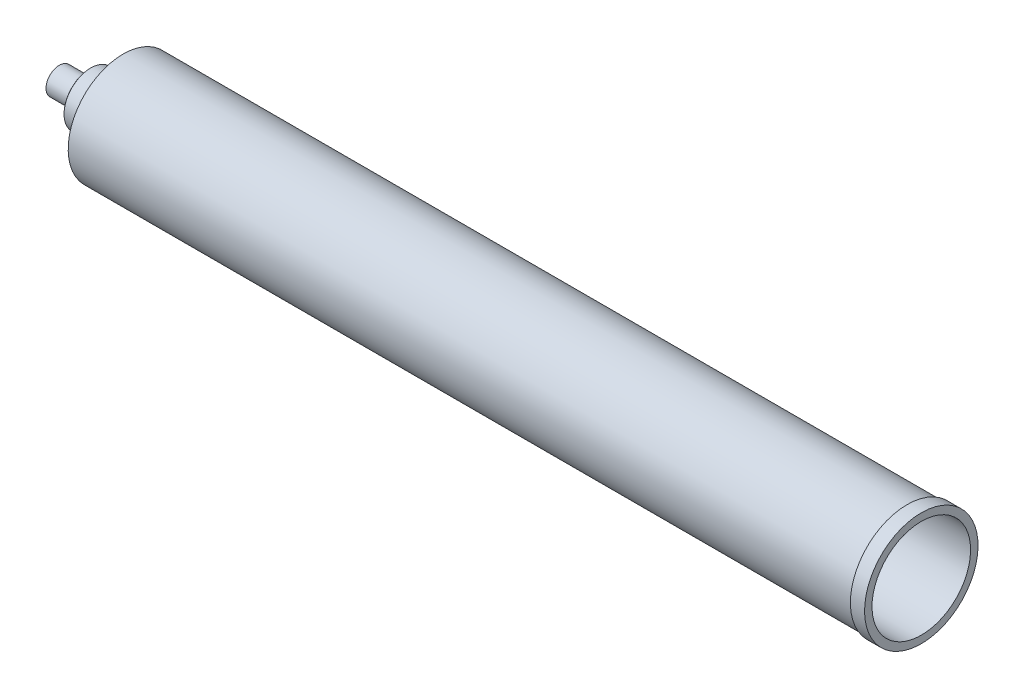
ISO-10303-21;
HEADER;
FILE_DESCRIPTION(('STEP AP214'),'2;1');
FILE_NAME('part.step','',(''),(''),'','','');
FILE_SCHEMA(('AUTOMOTIVE_DESIGN { 1 0 10303 214 1 1 1 1 }'));
ENDSEC;
DATA;
#1=APPLICATION_CONTEXT('core data for automotive mechanical design processes');
#2=APPLICATION_PROTOCOL_DEFINITION('international standard','automotive_design',2000,#1);
#3=PRODUCT_CONTEXT('',#1,'mechanical');
#4=PRODUCT('Part','Part','',(#3));
#5=PRODUCT_RELATED_PRODUCT_CATEGORY('part','',(#4));
#6=PRODUCT_DEFINITION_FORMATION('','',#4);
#7=PRODUCT_DEFINITION_CONTEXT('part definition',#1,'design');
#8=PRODUCT_DEFINITION('design','',#6,#7);
#9=PRODUCT_DEFINITION_SHAPE('','',#8);
#10=(LENGTH_UNIT() NAMED_UNIT(*) SI_UNIT(.MILLI.,.METRE.));
#11=(NAMED_UNIT(*) PLANE_ANGLE_UNIT() SI_UNIT($,.RADIAN.));
#12=(NAMED_UNIT(*) SI_UNIT($,.STERADIAN.) SOLID_ANGLE_UNIT());
#13=UNCERTAINTY_MEASURE_WITH_UNIT(LENGTH_MEASURE(1.E-05),#10,'distance_accuracy_value','');
#14=(GEOMETRIC_REPRESENTATION_CONTEXT(3) GLOBAL_UNCERTAINTY_ASSIGNED_CONTEXT((#13)) GLOBAL_UNIT_ASSIGNED_CONTEXT((#10,
#11,#12)) REPRESENTATION_CONTEXT('',''));
#15=CARTESIAN_POINT('',(0.,0.,0.));
#16=DIRECTION('',(0.,0.,1.));
#17=DIRECTION('',(1.,0.,0.));
#18=AXIS2_PLACEMENT_3D('',#15,#16,#17);
#19=CARTESIAN_POINT('',(62.23,0.,0.));
#20=DIRECTION('',(1.,0.,0.));
#21=DIRECTION('',(0.,1.,0.));
#22=AXIS2_PLACEMENT_3D('',#19,#20,#21);
#23=PLANE('',#22);
#24=CARTESIAN_POINT('',(62.23,0.,0.));
#25=DIRECTION('',(1.,0.,0.));
#26=DIRECTION('',(0.,1.,0.));
#27=AXIS2_PLACEMENT_3D('',#24,#25,#26);
#28=CIRCLE('',#27,44.1325);
#29=CARTESIAN_POINT('',(62.23,44.1325,0.));
#30=VERTEX_POINT('',#29);
#31=EDGE_CURVE('E11',#30,#30,#28,.T.);
#32=ORIENTED_EDGE('',*,*,#31,.T.);
#33=EDGE_LOOP('',(#32));
#34=FACE_BOUND('',#33,.T.);
#35=ADVANCED_FACE('F36',(#34),#23,.T.);
#36=CARTESIAN_POINT('',(62.23,0.,0.));
#37=DIRECTION('',(1.,0.,0.));
#38=DIRECTION('',(0.,1.,0.));
#39=AXIS2_PLACEMENT_3D('',#36,#37,#38);
#40=CYLINDRICAL_SURFACE('',#39,44.1325);
#41=CARTESIAN_POINT('',(771.906,0.,0.));
#42=DIRECTION('',(1.,0.,0.));
#43=DIRECTION('',(0.,1.,0.));
#44=AXIS2_PLACEMENT_3D('',#41,#42,#43);
#45=CIRCLE('',#44,44.1325);
#46=CARTESIAN_POINT('',(771.906,44.1325,0.));
#47=VERTEX_POINT('',#46);
#48=EDGE_CURVE('E42',#47,#47,#45,.T.);
#49=ORIENTED_EDGE('',*,*,#48,.T.);
#50=EDGE_LOOP('',(#49));
#51=FACE_BOUND('',#50,.T.);
#52=ORIENTED_EDGE('',*,*,#31,.F.);
#53=EDGE_LOOP('',(#52));
#54=FACE_BOUND('',#53,.T.);
#55=ADVANCED_FACE('F58',(#51,#54),#40,.F.);
#56=CARTESIAN_POINT('',(771.906,49.2125,0.));
#57=DIRECTION('',(1.,0.,0.));
#58=DIRECTION('',(0.,1.,0.));
#59=AXIS2_PLACEMENT_3D('',#56,#57,#58);
#60=PLANE('',#59);
#61=CARTESIAN_POINT('',(771.906,0.,0.));
#62=DIRECTION('',(1.,0.,0.));
#63=DIRECTION('',(0.,1.,0.));
#64=AXIS2_PLACEMENT_3D('',#61,#62,#63);
#65=CIRCLE('',#64,50.8000000000001);
#66=CARTESIAN_POINT('',(771.906,50.8000000000001,0.));
#67=VERTEX_POINT('',#66);
#68=EDGE_CURVE('E171',#67,#67,#65,.T.);
#69=ORIENTED_EDGE('',*,*,#68,.T.);
#70=EDGE_LOOP('',(#69));
#71=FACE_BOUND('',#70,.T.);
#72=ORIENTED_EDGE('',*,*,#48,.F.);
#73=EDGE_LOOP('',(#72));
#74=FACE_BOUND('',#73,.T.);
#75=ADVANCED_FACE('F63',(#71,#74),#60,.T.);
#76=CARTESIAN_POINT('',(62.23,0.,0.));
#77=DIRECTION('',(1.,0.,0.));
#78=DIRECTION('',(0.,1.,0.));
#79=AXIS2_PLACEMENT_3D('',#76,#77,#78);
#80=CYLINDRICAL_SURFACE('',#79,50.8000000000001);
#81=CARTESIAN_POINT('',(759.206,0.,0.));
#82=DIRECTION('',(1.,0.,0.));
#83=DIRECTION('',(0.,1.,0.));
#84=AXIS2_PLACEMENT_3D('',#81,#82,#83);
#85=CIRCLE('',#84,50.8000000000001);
#86=CARTESIAN_POINT('',(759.206,50.8000000000001,0.));
#87=VERTEX_POINT('',#86);
#88=EDGE_CURVE('E168',#87,#87,#85,.T.);
#89=ORIENTED_EDGE('',*,*,#88,.T.);
#90=EDGE_LOOP('',(#89));
#91=FACE_BOUND('',#90,.T.);
#92=ORIENTED_EDGE('',*,*,#68,.F.);
#93=EDGE_LOOP('',(#92));
#94=FACE_BOUND('',#93,.T.);
#95=ADVANCED_FACE('F70',(#91,#94),#80,.T.);
#96=CARTESIAN_POINT('',(759.206,49.2125,0.));
#97=DIRECTION('',(-1.,0.,0.));
#98=DIRECTION('',(0.,-1.,0.));
#99=AXIS2_PLACEMENT_3D('',#96,#97,#98);
#100=PLANE('',#99);
#101=CARTESIAN_POINT('',(759.206,0.,0.));
#102=DIRECTION('',(1.,0.,0.));
#103=DIRECTION('',(0.,1.,0.));
#104=AXIS2_PLACEMENT_3D('',#101,#102,#103);
#105=CIRCLE('',#104,49.2125);
#106=CARTESIAN_POINT('',(759.206,49.2125,0.));
#107=VERTEX_POINT('',#106);
#108=EDGE_CURVE('E165',#107,#107,#105,.T.);
#109=ORIENTED_EDGE('',*,*,#108,.T.);
#110=EDGE_LOOP('',(#109));
#111=FACE_BOUND('',#110,.T.);
#112=ORIENTED_EDGE('',*,*,#88,.F.);
#113=EDGE_LOOP('',(#112));
#114=FACE_BOUND('',#113,.T.);
#115=ADVANCED_FACE('F77',(#111,#114),#100,.T.);
#116=CARTESIAN_POINT('',(62.23,0.,0.));
#117=DIRECTION('',(1.,0.,0.));
#118=DIRECTION('',(0.,1.,0.));
#119=AXIS2_PLACEMENT_3D('',#116,#117,#118);
#120=CYLINDRICAL_SURFACE('',#119,49.2125);
#121=CARTESIAN_POINT('',(57.15,0.,0.));
#122=DIRECTION('',(1.,0.,0.));
#123=DIRECTION('',(0.,1.,0.));
#124=AXIS2_PLACEMENT_3D('',#121,#122,#123);
#125=CIRCLE('',#124,49.2125);
#126=CARTESIAN_POINT('',(57.15,49.2125,0.));
#127=VERTEX_POINT('',#126);
#128=EDGE_CURVE('E162',#127,#127,#125,.T.);
#129=ORIENTED_EDGE('',*,*,#128,.T.);
#130=EDGE_LOOP('',(#129));
#131=FACE_BOUND('',#130,.T.);
#132=ORIENTED_EDGE('',*,*,#108,.F.);
#133=EDGE_LOOP('',(#132));
#134=FACE_BOUND('',#133,.T.);
#135=ADVANCED_FACE('F81',(#131,#134),#120,.T.);
#136=CARTESIAN_POINT('',(57.15,23.876,0.));
#137=DIRECTION('',(-1.,0.,0.));
#138=DIRECTION('',(0.,-1.,0.));
#139=AXIS2_PLACEMENT_3D('',#136,#137,#138);
#140=PLANE('',#139);
#141=CARTESIAN_POINT('',(57.15,0.,0.));
#142=DIRECTION('',(1.,0.,0.));
#143=DIRECTION('',(0.,1.,0.));
#144=AXIS2_PLACEMENT_3D('',#141,#142,#143);
#145=CIRCLE('',#144,23.876);
#146=CARTESIAN_POINT('',(57.15,23.876,0.));
#147=VERTEX_POINT('',#146);
#148=EDGE_CURVE('E159',#147,#147,#145,.T.);
#149=ORIENTED_EDGE('',*,*,#148,.T.);
#150=EDGE_LOOP('',(#149));
#151=FACE_BOUND('',#150,.T.);
#152=ORIENTED_EDGE('',*,*,#128,.F.);
#153=EDGE_LOOP('',(#152));
#154=FACE_BOUND('',#153,.T.);
#155=ADVANCED_FACE('F85',(#151,#154),#140,.T.);
#156=CARTESIAN_POINT('',(62.23,0.,0.));
#157=DIRECTION('',(1.,0.,0.));
#158=DIRECTION('',(0.,1.,0.));
#159=AXIS2_PLACEMENT_3D('',#156,#157,#158);
#160=CYLINDRICAL_SURFACE('',#159,23.876);
#161=CARTESIAN_POINT('',(28.1044065311285,0.,0.));
#162=DIRECTION('',(1.,0.,0.));
#163=DIRECTION('',(0.,1.,0.));
#164=AXIS2_PLACEMENT_3D('',#161,#162,#163);
#165=CIRCLE('',#164,23.876);
#166=CARTESIAN_POINT('',(28.1044065311285,23.876,0.));
#167=VERTEX_POINT('',#166);
#168=EDGE_CURVE('E156',#167,#167,#165,.T.);
#169=ORIENTED_EDGE('',*,*,#168,.T.);
#170=EDGE_LOOP('',(#169));
#171=FACE_BOUND('',#170,.T.);
#172=ORIENTED_EDGE('',*,*,#148,.F.);
#173=EDGE_LOOP('',(#172));
#174=FACE_BOUND('',#173,.T.);
#175=ADVANCED_FACE('F89',(#171,#174),#160,.T.);
#176=CARTESIAN_POINT('',(28.1044065311285,0.,0.));
#177=DIRECTION('',(1.,0.,0.));
#178=DIRECTION('',(0.,1.,0.));
#179=AXIS2_PLACEMENT_3D('',#176,#177,#178);
#180=CONICAL_SURFACE('',#179,23.876,0.867608495422664);
#181=CARTESIAN_POINT('',(27.305,0.,0.));
#182=DIRECTION('',(1.,0.,0.));
#183=DIRECTION('',(0.,1.,0.));
#184=AXIS2_PLACEMENT_3D('',#181,#182,#183);
#185=CIRCLE('',#184,22.9330284091227);
#186=CARTESIAN_POINT('',(27.305,22.9330284091227,0.));
#187=VERTEX_POINT('',#186);
#188=EDGE_CURVE('E153',#187,#187,#185,.T.);
#189=ORIENTED_EDGE('',*,*,#188,.T.);
#190=EDGE_LOOP('',(#189));
#191=FACE_BOUND('',#190,.T.);
#192=ORIENTED_EDGE('',*,*,#168,.F.);
#193=EDGE_LOOP('',(#192));
#194=FACE_BOUND('',#193,.T.);
#195=ADVANCED_FACE('F93',(#191,#194),#180,.T.);
#196=CARTESIAN_POINT('',(27.305,14.478,0.));
#197=DIRECTION('',(-1.,0.,0.));
#198=DIRECTION('',(0.,-1.,0.));
#199=AXIS2_PLACEMENT_3D('',#196,#197,#198);
#200=PLANE('',#199);
#201=CARTESIAN_POINT('',(27.305,0.,0.));
#202=DIRECTION('',(1.,0.,0.));
#203=DIRECTION('',(0.,1.,0.));
#204=AXIS2_PLACEMENT_3D('',#201,#202,#203);
#205=CIRCLE('',#204,14.478);
#206=CARTESIAN_POINT('',(27.305,14.478,0.));
#207=VERTEX_POINT('',#206);
#208=EDGE_CURVE('E150',#207,#207,#205,.T.);
#209=ORIENTED_EDGE('',*,*,#208,.T.);
#210=EDGE_LOOP('',(#209));
#211=FACE_BOUND('',#210,.T.);
#212=ORIENTED_EDGE('',*,*,#188,.F.);
#213=EDGE_LOOP('',(#212));
#214=FACE_BOUND('',#213,.T.);
#215=ADVANCED_FACE('F97',(#211,#214),#200,.T.);
#216=CARTESIAN_POINT('',(24.765,0.,0.));
#217=DIRECTION('',(1.,0.,0.));
#218=DIRECTION('',(0.,1.,0.));
#219=AXIS2_PLACEMENT_3D('',#216,#217,#218);
#220=TOROIDAL_SURFACE('',#219,14.478,2.54);
#221=CARTESIAN_POINT('',(24.765,0.,0.));
#222=DIRECTION('',(1.,0.,0.));
#223=DIRECTION('',(0.,1.,0.));
#224=AXIS2_PLACEMENT_3D('',#221,#222,#223);
#225=CIRCLE('',#224,11.938);
#226=CARTESIAN_POINT('',(24.765,11.938,0.));
#227=VERTEX_POINT('',#226);
#228=EDGE_CURVE('E147',#227,#227,#225,.T.);
#229=ORIENTED_EDGE('',*,*,#228,.T.);
#230=EDGE_LOOP('',(#229));
#231=FACE_BOUND('',#230,.T.);
#232=ORIENTED_EDGE('',*,*,#208,.F.);
#233=EDGE_LOOP('',(#232));
#234=FACE_BOUND('',#233,.T.);
#235=ADVANCED_FACE('F101',(#231,#234),#220,.F.);
#236=CARTESIAN_POINT('',(62.23,0.,0.));
#237=DIRECTION('',(1.,0.,0.));
#238=DIRECTION('',(0.,1.,0.));
#239=AXIS2_PLACEMENT_3D('',#236,#237,#238);
#240=CYLINDRICAL_SURFACE('',#239,11.938);
#241=CARTESIAN_POINT('',(0.,0.,0.));
#242=DIRECTION('',(1.,0.,0.));
#243=DIRECTION('',(0.,1.,0.));
#244=AXIS2_PLACEMENT_3D('',#241,#242,#243);
#245=CIRCLE('',#244,11.938);
#246=CARTESIAN_POINT('',(0.,11.938,0.));
#247=VERTEX_POINT('',#246);
#248=EDGE_CURVE('E144',#247,#247,#245,.T.);
#249=ORIENTED_EDGE('',*,*,#248,.T.);
#250=EDGE_LOOP('',(#249));
#251=FACE_BOUND('',#250,.T.);
#252=ORIENTED_EDGE('',*,*,#228,.F.);
#253=EDGE_LOOP('',(#252));
#254=FACE_BOUND('',#253,.T.);
#255=ADVANCED_FACE('F105',(#251,#254),#240,.T.);
#256=CARTESIAN_POINT('',(0.,0.,0.));
#257=DIRECTION('',(-1.,0.,0.));
#258=DIRECTION('',(0.,-1.,0.));
#259=AXIS2_PLACEMENT_3D('',#256,#257,#258);
#260=PLANE('',#259);
#261=CARTESIAN_POINT('',(0.,0.,0.));
#262=DIRECTION('',(1.,0.,0.));
#263=DIRECTION('',(0.,0.,-1.));
#264=AXIS2_PLACEMENT_3D('',#261,#262,#263);
#265=CIRCLE('',#264,8.35025);
#266=CARTESIAN_POINT('',(0.,0.,-8.35025));
#267=VERTEX_POINT('',#266);
#268=EDGE_CURVE('E136',#267,#267,#265,.T.);
#269=ORIENTED_EDGE('',*,*,#268,.T.);
#270=EDGE_LOOP('',(#269));
#271=FACE_BOUND('',#270,.T.);
#272=ORIENTED_EDGE('',*,*,#248,.F.);
#273=EDGE_LOOP('',(#272));
#274=FACE_BOUND('',#273,.T.);
#275=ADVANCED_FACE('F109',(#271,#274),#260,.T.);
#276=CARTESIAN_POINT('',(1.905,0.,0.));
#277=DIRECTION('',(-1.,0.,0.));
#278=DIRECTION('',(0.,0.,1.));
#279=AXIS2_PLACEMENT_3D('',#276,#277,#278);
#280=CONICAL_SURFACE('',#279,6.556375,0.755364278732698);
#281=ORIENTED_EDGE('',*,*,#268,.F.);
#282=EDGE_LOOP('',(#281));
#283=FACE_BOUND('',#282,.T.);
#284=CARTESIAN_POINT('',(1.905,0.,0.));
#285=DIRECTION('',(1.,0.,0.));
#286=DIRECTION('',(0.,0.,-1.));
#287=AXIS2_PLACEMENT_3D('',#284,#285,#286);
#288=CIRCLE('',#287,6.556375);
#289=CARTESIAN_POINT('',(1.905,0.,-6.556375));
#290=VERTEX_POINT('',#289);
#291=EDGE_CURVE('E133',#290,#290,#288,.T.);
#292=ORIENTED_EDGE('',*,*,#291,.T.);
#293=EDGE_LOOP('',(#292));
#294=FACE_BOUND('',#293,.T.);
#295=ADVANCED_FACE('F113',(#283,#294),#280,.F.);
#296=CARTESIAN_POINT('',(1.905,0.,-6.556375));
#297=DIRECTION('',(1.,0.,0.));
#298=DIRECTION('',(0.,0.,-1.));
#299=AXIS2_PLACEMENT_3D('',#296,#297,#298);
#300=PLANE('',#299);
#301=CARTESIAN_POINT('',(1.905,0.,0.));
#302=DIRECTION('',(-1.,0.,0.));
#303=DIRECTION('',(0.,0.,1.));
#304=AXIS2_PLACEMENT_3D('',#301,#302,#303);
#305=CIRCLE('',#304,4.);
#306=CARTESIAN_POINT('',(1.905,0.,4.));
#307=VERTEX_POINT('',#306);
#308=EDGE_CURVE('E132',#307,#307,#305,.T.);
#309=ORIENTED_EDGE('',*,*,#308,.F.);
#310=EDGE_LOOP('',(#309));
#311=FACE_BOUND('',#310,.T.);
#312=ORIENTED_EDGE('',*,*,#291,.F.);
#313=EDGE_LOOP('',(#312));
#314=FACE_BOUND('',#313,.T.);
#315=ADVANCED_FACE('F117',(#311,#314),#300,.F.);
#316=CARTESIAN_POINT('',(27.305,0.,0.));
#317=DIRECTION('',(-1.,0.,0.));
#318=DIRECTION('',(0.,0.,1.));
#319=AXIS2_PLACEMENT_3D('',#316,#317,#318);
#320=CYLINDRICAL_SURFACE('',#319,4.);
#321=CARTESIAN_POINT('',(27.305,0.,0.));
#322=DIRECTION('',(-1.,0.,0.));
#323=DIRECTION('',(0.,0.,1.));
#324=AXIS2_PLACEMENT_3D('',#321,#322,#323);
#325=CIRCLE('',#324,4.);
#326=CARTESIAN_POINT('',(27.305,0.,4.));
#327=VERTEX_POINT('',#326);
#328=EDGE_CURVE('E129',#327,#327,#325,.T.);
#329=ORIENTED_EDGE('',*,*,#328,.F.);
#330=EDGE_LOOP('',(#329));
#331=FACE_BOUND('',#330,.T.);
#332=ORIENTED_EDGE('',*,*,#308,.T.);
#333=EDGE_LOOP('',(#332));
#334=FACE_BOUND('',#333,.T.);
#335=ADVANCED_FACE('F53',(#331,#334),#320,.F.);
#336=CARTESIAN_POINT('',(27.305,0.,0.));
#337=DIRECTION('',(1.,0.,0.));
#338=DIRECTION('',(0.,0.,-1.));
#339=AXIS2_PLACEMENT_3D('',#336,#337,#338);
#340=PLANE('',#339);
#341=CARTESIAN_POINT('',(27.305,0.,0.));
#342=DIRECTION('',(-1.,0.,0.));
#343=DIRECTION('',(0.,0.,1.));
#344=AXIS2_PLACEMENT_3D('',#341,#342,#343);
#345=CIRCLE('',#344,6.35105942758608);
#346=CARTESIAN_POINT('',(27.305,0.,6.35105942758608));
#347=VERTEX_POINT('',#346);
#348=EDGE_CURVE('E138',#347,#347,#345,.T.);
#349=ORIENTED_EDGE('',*,*,#348,.F.);
#350=EDGE_LOOP('',(#349));
#351=FACE_BOUND('',#350,.T.);
#352=ORIENTED_EDGE('',*,*,#328,.T.);
#353=EDGE_LOOP('',(#352));
#354=FACE_BOUND('',#353,.T.);
#355=ADVANCED_FACE('F47',(#351,#354),#340,.T.);
#356=CARTESIAN_POINT('',(28.575,0.,0.));
#357=DIRECTION('',(-1.,0.,0.));
#358=DIRECTION('',(0.,0.,1.));
#359=AXIS2_PLACEMENT_3D('',#356,#357,#358);
#360=CONICAL_SURFACE('',#359,0.,1.37343284621992);
#361=ORIENTED_EDGE('',*,*,#348,.T.);
#362=EDGE_LOOP('',(#361));
#363=FACE_BOUND('',#362,.T.);
#364=CARTESIAN_POINT('',(28.575,0.,0.));
#365=VERTEX_POINT('',#364);
#366=VERTEX_LOOP('',#365);
#367=FACE_BOUND('',#366,.T.);
#368=ADVANCED_FACE('F45',(#363,#367),#360,.F.);
#369=CLOSED_SHELL('',(#35,#55,#75,#95,#115,#135,#155,#175,#195,#215,#235,#255,#275,#295,#315,
#335,#355,#368));
#370=MANIFOLD_SOLID_BREP('B2',#369);
#371=ADVANCED_BREP_SHAPE_REPRESENTATION('',(#18,#370),#14);
#372=SHAPE_DEFINITION_REPRESENTATION(#9,#371);
ENDSEC;
END-ISO-10303-21;
